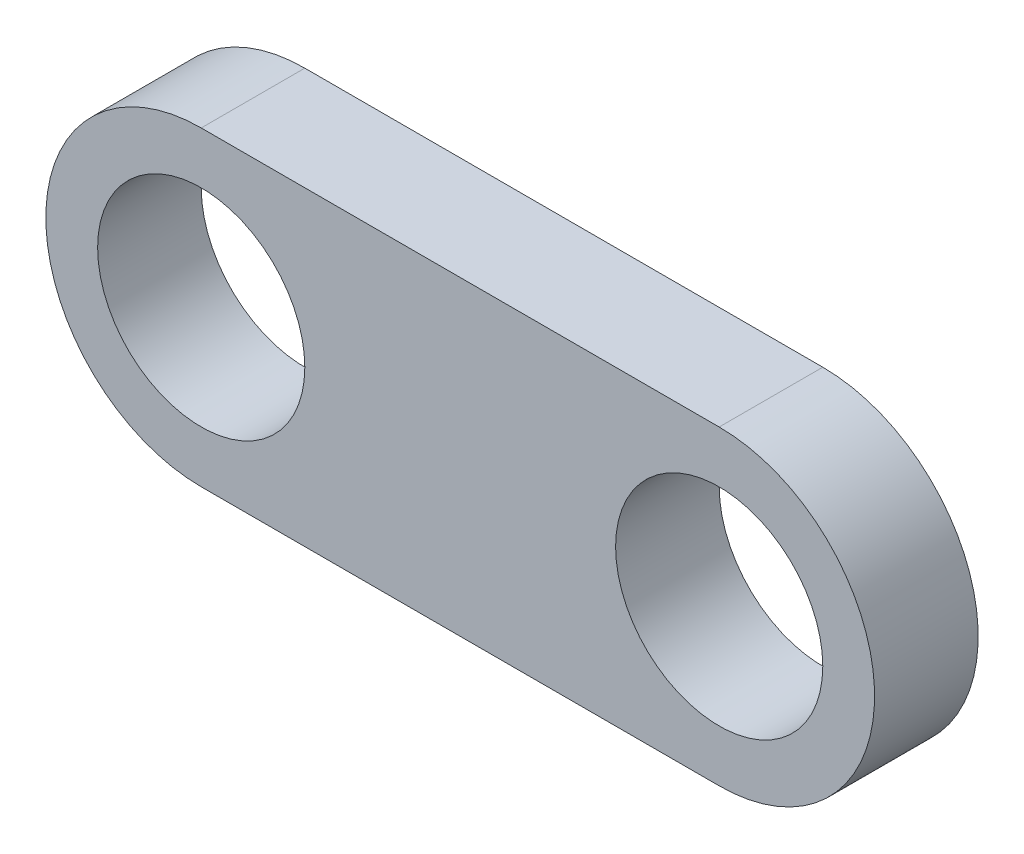
ISO-10303-21;
HEADER;
FILE_DESCRIPTION(('STEP AP214'),'2;1');
FILE_NAME('part.step','',(''),(''),'','','');
FILE_SCHEMA(('AUTOMOTIVE_DESIGN { 1 0 10303 214 1 1 1 1 }'));
ENDSEC;
DATA;
#1=APPLICATION_CONTEXT('core data for automotive mechanical design processes');
#2=APPLICATION_PROTOCOL_DEFINITION('international standard','automotive_design',2000,#1);
#3=PRODUCT_CONTEXT('',#1,'mechanical');
#4=PRODUCT('Part','Part','',(#3));
#5=PRODUCT_RELATED_PRODUCT_CATEGORY('part','',(#4));
#6=PRODUCT_DEFINITION_FORMATION('','',#4);
#7=PRODUCT_DEFINITION_CONTEXT('part definition',#1,'design');
#8=PRODUCT_DEFINITION('design','',#6,#7);
#9=PRODUCT_DEFINITION_SHAPE('','',#8);
#10=(LENGTH_UNIT() NAMED_UNIT(*) SI_UNIT(.MILLI.,.METRE.));
#11=(NAMED_UNIT(*) PLANE_ANGLE_UNIT() SI_UNIT($,.RADIAN.));
#12=(NAMED_UNIT(*) SI_UNIT($,.STERADIAN.) SOLID_ANGLE_UNIT());
#13=UNCERTAINTY_MEASURE_WITH_UNIT(LENGTH_MEASURE(1.E-05),#10,'distance_accuracy_value','');
#14=(GEOMETRIC_REPRESENTATION_CONTEXT(3) GLOBAL_UNCERTAINTY_ASSIGNED_CONTEXT((#13)) GLOBAL_UNIT_ASSIGNED_CONTEXT((#10,
#11,#12)) REPRESENTATION_CONTEXT('',''));
#15=CARTESIAN_POINT('',(0.,0.,0.));
#16=DIRECTION('',(0.,0.,1.));
#17=DIRECTION('',(1.,0.,0.));
#18=AXIS2_PLACEMENT_3D('',#15,#16,#17);
#19=CARTESIAN_POINT('',(0.,1.38777878078145E-13,4.99999999999996));
#20=DIRECTION('',(0.,0.,1.));
#21=DIRECTION('',(1.00000000000001,0.,0.));
#22=AXIS2_PLACEMENT_3D('',#19,#20,#21);
#23=PLANE('',#22);
#24=CARTESIAN_POINT('',(-50.0000000000005,1.66533453693773E-13,4.99999999999998));
#25=DIRECTION('',(0.,0.,1.));
#26=DIRECTION('',(1.00000000000001,0.,0.));
#27=AXIS2_PLACEMENT_3D('',#24,#25,#26);
#28=CIRCLE('',#27,10.);
#29=CARTESIAN_POINT('',(-40.0000000000004,1.67366120962242E-13,4.99999999999998));
#30=VERTEX_POINT('',#29);
#31=EDGE_CURVE('E115',#30,#30,#28,.T.);
#32=ORIENTED_EDGE('',*,*,#31,.F.);
#33=EDGE_LOOP('',(#32));
#34=FACE_BOUND('',#33,.T.);
#35=CARTESIAN_POINT('',(0.,1.38777878078145E-13,4.99999999999996));
#36=DIRECTION('',(0.,0.,1.));
#37=DIRECTION('',(1.00000000000001,0.,0.));
#38=AXIS2_PLACEMENT_3D('',#35,#36,#37);
#39=CIRCLE('',#38,15.);
#40=CARTESIAN_POINT('',(1.45716771982052E-13,-14.9999999999998,5.00000000000001));
#41=VERTEX_POINT('',#40);
#42=CARTESIAN_POINT('',(2.18575157973078E-13,15.0000000000001,4.99999999999999));
#43=VERTEX_POINT('',#42);
#44=EDGE_CURVE('E94',#41,#43,#39,.T.);
#45=ORIENTED_EDGE('',*,*,#44,.T.);
#46=DIRECTION('',(-1.00000000000001,0.,0.));
#47=VECTOR('',#46,1.);
#48=CARTESIAN_POINT('',(2.18575157973078E-13,15.0000000000001,4.99999999999999));
#49=LINE('',#48,#47);
#50=CARTESIAN_POINT('',(-50.0000000000003,15.0000000000001,5.));
#51=VERTEX_POINT('',#50);
#52=EDGE_CURVE('E89',#43,#51,#49,.T.);
#53=ORIENTED_EDGE('',*,*,#52,.T.);
#54=CARTESIAN_POINT('',(-50.0000000000005,1.66533453693773E-13,4.99999999999998));
#55=DIRECTION('',(0.,0.,1.));
#56=DIRECTION('',(1.00000000000001,0.,0.));
#57=AXIS2_PLACEMENT_3D('',#54,#55,#56);
#58=CIRCLE('',#57,15.);
#59=CARTESIAN_POINT('',(-50.0000000000003,-15.,5.00000000000001));
#60=VERTEX_POINT('',#59);
#61=EDGE_CURVE('E92',#51,#60,#58,.T.);
#62=ORIENTED_EDGE('',*,*,#61,.T.);
#63=DIRECTION('',(1.00000000000001,0.,0.));
#64=VECTOR('',#63,1.);
#65=CARTESIAN_POINT('',(1.45716771982052E-13,-14.9999999999998,5.00000000000001));
#66=LINE('',#65,#64);
#67=EDGE_CURVE('E59',#60,#41,#66,.T.);
#68=ORIENTED_EDGE('',*,*,#67,.T.);
#69=EDGE_LOOP('',(#45,#53,#62,#68));
#70=FACE_BOUND('',#69,.T.);
#71=CARTESIAN_POINT('',(0.,1.38777878078145E-13,4.99999999999996));
#72=DIRECTION('',(0.,0.,1.));
#73=DIRECTION('',(1.00000000000001,0.,0.));
#74=AXIS2_PLACEMENT_3D('',#71,#72,#73);
#75=CIRCLE('',#74,10.);
#76=CARTESIAN_POINT('',(10.0000000000001,1.39610545346613E-13,4.99999999999996));
#77=VERTEX_POINT('',#76);
#78=EDGE_CURVE('E139',#77,#77,#75,.T.);
#79=ORIENTED_EDGE('',*,*,#78,.F.);
#80=EDGE_LOOP('',(#79));
#81=FACE_BOUND('',#80,.T.);
#82=ADVANCED_FACE('F41',(#34,#70,#81),#23,.T.);
#83=CARTESIAN_POINT('',(0.,0.,-5.));
#84=DIRECTION('',(0.,0.,1.));
#85=DIRECTION('',(1.00000000000001,0.,0.));
#86=AXIS2_PLACEMENT_3D('',#83,#84,#85);
#87=PLANE('',#86);
#88=CARTESIAN_POINT('',(0.,0.,-5.));
#89=DIRECTION('',(0.,0.,1.));
#90=DIRECTION('',(1.00000000000001,0.,0.));
#91=AXIS2_PLACEMENT_3D('',#88,#89,#90);
#92=CIRCLE('',#91,15.);
#93=CARTESIAN_POINT('',(0.,-14.9999999999997,-4.99999999999988));
#94=VERTEX_POINT('',#93);
#95=CARTESIAN_POINT('',(2.08166817117217E-13,15.0000000000002,-5.));
#96=VERTEX_POINT('',#95);
#97=EDGE_CURVE('E111',#94,#96,#92,.T.);
#98=ORIENTED_EDGE('',*,*,#97,.F.);
#99=DIRECTION('',(1.00000000000001,0.,0.));
#100=VECTOR('',#99,1.);
#101=CARTESIAN_POINT('',(0.,-14.9999999999997,-4.99999999999988));
#102=LINE('',#101,#100);
#103=CARTESIAN_POINT('',(-50.0000000000006,-14.9999999999997,-4.99999999999987));
#104=VERTEX_POINT('',#103);
#105=EDGE_CURVE('E82',#104,#94,#102,.T.);
#106=ORIENTED_EDGE('',*,*,#105,.F.);
#107=CARTESIAN_POINT('',(-50.0000000000003,1.94289029309402E-13,-4.99999999999992));
#108=DIRECTION('',(0.,0.,1.));
#109=DIRECTION('',(1.00000000000001,0.,0.));
#110=AXIS2_PLACEMENT_3D('',#107,#108,#109);
#111=CIRCLE('',#110,15.);
#112=CARTESIAN_POINT('',(-50.0000000000004,15.0000000000002,-4.99999999999997));
#113=VERTEX_POINT('',#112);
#114=EDGE_CURVE('E76',#113,#104,#111,.T.);
#115=ORIENTED_EDGE('',*,*,#114,.F.);
#116=DIRECTION('',(-1.00000000000001,0.,0.));
#117=VECTOR('',#116,1.);
#118=CARTESIAN_POINT('',(2.08166817117217E-13,15.0000000000002,-5.));
#119=LINE('',#118,#117);
#120=EDGE_CURVE('E99',#96,#113,#119,.T.);
#121=ORIENTED_EDGE('',*,*,#120,.F.);
#122=EDGE_LOOP('',(#98,#106,#115,#121));
#123=FACE_BOUND('',#122,.T.);
#124=CARTESIAN_POINT('',(-50.0000000000003,1.94289029309402E-13,-4.99999999999992));
#125=DIRECTION('',(0.,0.,1.));
#126=DIRECTION('',(1.00000000000001,0.,0.));
#127=AXIS2_PLACEMENT_3D('',#124,#125,#126);
#128=CIRCLE('',#127,10.);
#129=CARTESIAN_POINT('',(-40.0000000000003,1.95121696577871E-13,-4.99999999999992));
#130=VERTEX_POINT('',#129);
#131=EDGE_CURVE('E135',#130,#130,#128,.T.);
#132=ORIENTED_EDGE('',*,*,#131,.T.);
#133=EDGE_LOOP('',(#132));
#134=FACE_BOUND('',#133,.T.);
#135=CARTESIAN_POINT('',(0.,0.,-5.));
#136=DIRECTION('',(0.,0.,1.));
#137=DIRECTION('',(1.00000000000001,0.,0.));
#138=AXIS2_PLACEMENT_3D('',#135,#136,#137);
#139=CIRCLE('',#138,10.);
#140=CARTESIAN_POINT('',(10.0000000000001,0.,-5.));
#141=VERTEX_POINT('',#140);
#142=EDGE_CURVE('E143',#141,#141,#139,.T.);
#143=ORIENTED_EDGE('',*,*,#142,.T.);
#144=EDGE_LOOP('',(#143));
#145=FACE_BOUND('',#144,.T.);
#146=ADVANCED_FACE('F129',(#123,#134,#145),#87,.F.);
#147=CARTESIAN_POINT('',(0.,1.38777878078145E-13,4.99999999999996));
#148=DIRECTION('',(0.,0.,-1.));
#149=DIRECTION('',(-1.00000000000001,0.,0.));
#150=AXIS2_PLACEMENT_3D('',#147,#148,#149);
#151=CYLINDRICAL_SURFACE('',#150,15.);
#152=ORIENTED_EDGE('',*,*,#97,.T.);
#153=DIRECTION('',(0.,0.,-1.));
#154=VECTOR('',#153,1.);
#155=CARTESIAN_POINT('',(2.18575157973078E-13,15.0000000000001,4.99999999999999));
#156=LINE('',#155,#154);
#157=EDGE_CURVE('E11',#43,#96,#156,.T.);
#158=ORIENTED_EDGE('',*,*,#157,.F.);
#159=ORIENTED_EDGE('',*,*,#44,.F.);
#160=DIRECTION('',(0.,0.,-1.));
#161=VECTOR('',#160,1.);
#162=CARTESIAN_POINT('',(1.45716771982052E-13,-14.9999999999998,5.00000000000001));
#163=LINE('',#162,#161);
#164=EDGE_CURVE('E107',#41,#94,#163,.T.);
#165=ORIENTED_EDGE('',*,*,#164,.T.);
#166=EDGE_LOOP('',(#152,#158,#159,#165));
#167=FACE_BOUND('',#166,.T.);
#168=ADVANCED_FACE('F43',(#167),#151,.T.);
#169=CARTESIAN_POINT('',(2.18575157973078E-13,15.0000000000001,4.99999999999999));
#170=DIRECTION('',(0.,-1.,0.));
#171=DIRECTION('',(1.00000000000001,0.,0.));
#172=AXIS2_PLACEMENT_3D('',#169,#170,#171);
#173=PLANE('',#172);
#174=ORIENTED_EDGE('',*,*,#120,.T.);
#175=DIRECTION('',(0.,0.,-1.));
#176=VECTOR('',#175,1.);
#177=CARTESIAN_POINT('',(-50.0000000000003,15.0000000000001,5.));
#178=LINE('',#177,#176);
#179=EDGE_CURVE('E51',#51,#113,#178,.T.);
#180=ORIENTED_EDGE('',*,*,#179,.F.);
#181=ORIENTED_EDGE('',*,*,#52,.F.);
#182=ORIENTED_EDGE('',*,*,#157,.T.);
#183=EDGE_LOOP('',(#174,#180,#181,#182));
#184=FACE_BOUND('',#183,.T.);
#185=ADVANCED_FACE('F98',(#184),#173,.F.);
#186=CARTESIAN_POINT('',(-50.0000000000005,1.66533453693773E-13,4.99999999999998));
#187=DIRECTION('',(0.,0.,-1.));
#188=DIRECTION('',(-1.00000000000001,0.,0.));
#189=AXIS2_PLACEMENT_3D('',#186,#187,#188);
#190=CYLINDRICAL_SURFACE('',#189,15.);
#191=ORIENTED_EDGE('',*,*,#114,.T.);
#192=DIRECTION('',(0.,0.,-1.));
#193=VECTOR('',#192,1.);
#194=CARTESIAN_POINT('',(-50.0000000000003,-15.,5.00000000000001));
#195=LINE('',#194,#193);
#196=EDGE_CURVE('E101',#60,#104,#195,.T.);
#197=ORIENTED_EDGE('',*,*,#196,.F.);
#198=ORIENTED_EDGE('',*,*,#61,.F.);
#199=ORIENTED_EDGE('',*,*,#179,.T.);
#200=EDGE_LOOP('',(#191,#197,#198,#199));
#201=FACE_BOUND('',#200,.T.);
#202=ADVANCED_FACE('F102',(#201),#190,.T.);
#203=CARTESIAN_POINT('',(1.45716771982052E-13,-14.9999999999998,5.00000000000001));
#204=DIRECTION('',(0.,1.,0.));
#205=DIRECTION('',(-1.00000000000001,0.,0.));
#206=AXIS2_PLACEMENT_3D('',#203,#204,#205);
#207=PLANE('',#206);
#208=ORIENTED_EDGE('',*,*,#105,.T.);
#209=ORIENTED_EDGE('',*,*,#164,.F.);
#210=ORIENTED_EDGE('',*,*,#67,.F.);
#211=ORIENTED_EDGE('',*,*,#196,.T.);
#212=EDGE_LOOP('',(#208,#209,#210,#211));
#213=FACE_BOUND('',#212,.T.);
#214=ADVANCED_FACE('F126',(#213),#207,.F.);
#215=CARTESIAN_POINT('',(-50.0000000000005,1.66533453693773E-13,4.99999999999998));
#216=DIRECTION('',(0.,0.,-1.));
#217=DIRECTION('',(-1.00000000000001,0.,0.));
#218=AXIS2_PLACEMENT_3D('',#215,#216,#217);
#219=CYLINDRICAL_SURFACE('',#218,10.);
#220=ORIENTED_EDGE('',*,*,#31,.T.);
#221=EDGE_LOOP('',(#220));
#222=FACE_BOUND('',#221,.T.);
#223=ORIENTED_EDGE('',*,*,#131,.F.);
#224=EDGE_LOOP('',(#223));
#225=FACE_BOUND('',#224,.T.);
#226=ADVANCED_FACE('F163',(#222,#225),#219,.F.);
#227=CARTESIAN_POINT('',(0.,1.38777878078145E-13,4.99999999999996));
#228=DIRECTION('',(0.,0.,-1.));
#229=DIRECTION('',(-1.00000000000001,0.,0.));
#230=AXIS2_PLACEMENT_3D('',#227,#228,#229);
#231=CYLINDRICAL_SURFACE('',#230,10.);
#232=ORIENTED_EDGE('',*,*,#78,.T.);
#233=EDGE_LOOP('',(#232));
#234=FACE_BOUND('',#233,.T.);
#235=ORIENTED_EDGE('',*,*,#142,.F.);
#236=EDGE_LOOP('',(#235));
#237=FACE_BOUND('',#236,.T.);
#238=ADVANCED_FACE('F152',(#234,#237),#231,.F.);
#239=CLOSED_SHELL('',(#82,#146,#168,#185,#202,#214,#226,#238));
#240=MANIFOLD_SOLID_BREP('B2',#239);
#241=ADVANCED_BREP_SHAPE_REPRESENTATION('',(#18,#240),#14);
#242=SHAPE_DEFINITION_REPRESENTATION(#9,#241);
ENDSEC;
END-ISO-10303-21;
